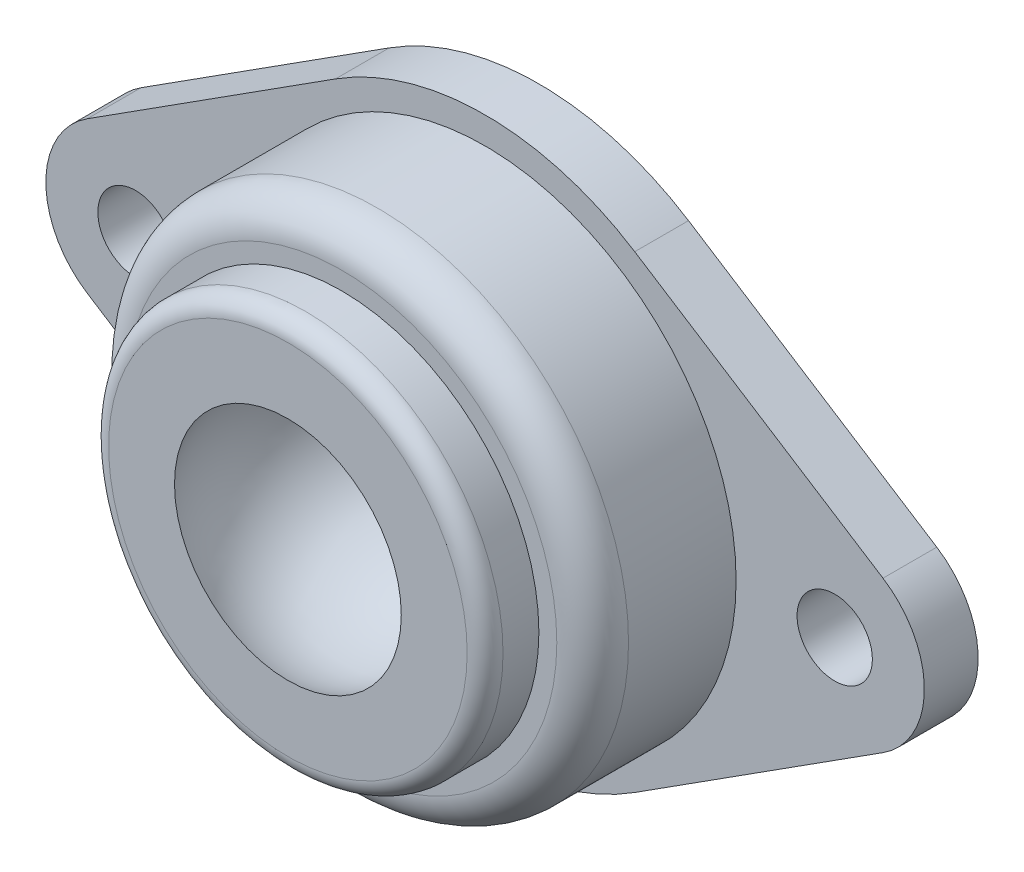
ISO-10303-21;
HEADER;
FILE_DESCRIPTION(('STEP AP214'),'2;1');
FILE_NAME('part.step','',(''),(''),'','','');
FILE_SCHEMA(('AUTOMOTIVE_DESIGN { 1 0 10303 214 1 1 1 1 }'));
ENDSEC;
DATA;
#1=APPLICATION_CONTEXT('core data for automotive mechanical design processes');
#2=APPLICATION_PROTOCOL_DEFINITION('international standard','automotive_design',2000,#1);
#3=PRODUCT_CONTEXT('',#1,'mechanical');
#4=PRODUCT('Part','Part','',(#3));
#5=PRODUCT_RELATED_PRODUCT_CATEGORY('part','',(#4));
#6=PRODUCT_DEFINITION_FORMATION('','',#4);
#7=PRODUCT_DEFINITION_CONTEXT('part definition',#1,'design');
#8=PRODUCT_DEFINITION('design','',#6,#7);
#9=PRODUCT_DEFINITION_SHAPE('','',#8);
#10=(LENGTH_UNIT() NAMED_UNIT(*) SI_UNIT(.MILLI.,.METRE.));
#11=(NAMED_UNIT(*) PLANE_ANGLE_UNIT() SI_UNIT($,.RADIAN.));
#12=(NAMED_UNIT(*) SI_UNIT($,.STERADIAN.) SOLID_ANGLE_UNIT());
#13=UNCERTAINTY_MEASURE_WITH_UNIT(LENGTH_MEASURE(1.E-05),#10,'distance_accuracy_value','');
#14=(GEOMETRIC_REPRESENTATION_CONTEXT(3) GLOBAL_UNCERTAINTY_ASSIGNED_CONTEXT((#13)) GLOBAL_UNIT_ASSIGNED_CONTEXT((#10,
#11,#12)) REPRESENTATION_CONTEXT('',''));
#15=CARTESIAN_POINT('',(0.,0.,0.));
#16=DIRECTION('',(0.,0.,1.));
#17=DIRECTION('',(1.,0.,0.));
#18=AXIS2_PLACEMENT_3D('',#15,#16,#17);
#19=CARTESIAN_POINT('',(-19.5,0.,3.));
#20=DIRECTION('',(0.,0.,1.));
#21=DIRECTION('',(1.,0.,0.));
#22=AXIS2_PLACEMENT_3D('',#19,#20,#21);
#23=PLANE('',#22);
#24=CARTESIAN_POINT('',(0.,0.,3.));
#25=DIRECTION('',(0.,0.,1.));
#26=DIRECTION('',(1.,0.,0.));
#27=AXIS2_PLACEMENT_3D('',#24,#25,#26);
#28=CIRCLE('',#27,14.);
#29=CARTESIAN_POINT('',(14.,0.,3.));
#30=VERTEX_POINT('',#29);
#31=EDGE_CURVE('E253',#30,#30,#28,.T.);
#32=ORIENTED_EDGE('',*,*,#31,.F.);
#33=EDGE_LOOP('',(#32));
#34=FACE_BOUND('',#33,.T.);
#35=CARTESIAN_POINT('',(-19.5,0.,3.));
#36=DIRECTION('',(0.,0.,1.));
#37=DIRECTION('',(1.,0.,0.));
#38=AXIS2_PLACEMENT_3D('',#35,#36,#37);
#39=CIRCLE('',#38,2.1);
#40=CARTESIAN_POINT('',(-17.4,0.,3.));
#41=VERTEX_POINT('',#40);
#42=EDGE_CURVE('E136',#41,#41,#39,.T.);
#43=ORIENTED_EDGE('',*,*,#42,.F.);
#44=EDGE_LOOP('',(#43));
#45=FACE_BOUND('',#44,.T.);
#46=CARTESIAN_POINT('',(-19.5,0.,3.));
#47=DIRECTION('',(0.,0.,1.));
#48=DIRECTION('',(1.,0.,0.));
#49=AXIS2_PLACEMENT_3D('',#46,#47,#48);
#50=CIRCLE('',#49,5.);
#51=CARTESIAN_POINT('',(-22.1923076923077,4.21325044234743,3.));
#52=VERTEX_POINT('',#51);
#53=CARTESIAN_POINT('',(-22.1923076923077,-4.21325044234743,3.));
#54=VERTEX_POINT('',#53);
#55=EDGE_CURVE('E147',#52,#54,#50,.T.);
#56=ORIENTED_EDGE('',*,*,#55,.T.);
#57=DIRECTION('',(0.842650088469486,-0.538461538461539,0.));
#58=VECTOR('',#57,1.);
#59=CARTESIAN_POINT('',(-22.1923076923077,-4.21325044234743,3.));
#60=LINE('',#59,#58);
#61=CARTESIAN_POINT('',(-8.34615384615386,-13.061076371277,3.));
#62=VERTEX_POINT('',#61);
#63=EDGE_CURVE('E95',#54,#62,#60,.T.);
#64=ORIENTED_EDGE('',*,*,#63,.T.);
#65=CARTESIAN_POINT('',(0.,0.,3.));
#66=DIRECTION('',(0.,0.,1.));
#67=DIRECTION('',(1.,0.,0.));
#68=AXIS2_PLACEMENT_3D('',#65,#66,#67);
#69=CIRCLE('',#68,15.5);
#70=CARTESIAN_POINT('',(8.34615384615384,-13.061076371277,3.));
#71=VERTEX_POINT('',#70);
#72=EDGE_CURVE('E236',#62,#71,#69,.T.);
#73=ORIENTED_EDGE('',*,*,#72,.T.);
#74=DIRECTION('',(0.842650088469486,0.538461538461538,0.));
#75=VECTOR('',#74,1.);
#76=CARTESIAN_POINT('',(8.34615384615384,-13.061076371277,3.));
#77=LINE('',#76,#75);
#78=CARTESIAN_POINT('',(22.1923076923077,-4.21325044234743,3.));
#79=VERTEX_POINT('',#78);
#80=EDGE_CURVE('E238',#71,#79,#77,.T.);
#81=ORIENTED_EDGE('',*,*,#80,.T.);
#82=CARTESIAN_POINT('',(19.5,0.,3.));
#83=DIRECTION('',(0.,0.,1.));
#84=DIRECTION('',(1.,0.,0.));
#85=AXIS2_PLACEMENT_3D('',#82,#83,#84);
#86=CIRCLE('',#85,5.);
#87=CARTESIAN_POINT('',(22.1923076923077,4.21325044234743,3.));
#88=VERTEX_POINT('',#87);
#89=EDGE_CURVE('E114',#79,#88,#86,.T.);
#90=ORIENTED_EDGE('',*,*,#89,.T.);
#91=DIRECTION('',(-0.842650088469486,0.538461538461538,0.));
#92=VECTOR('',#91,1.);
#93=CARTESIAN_POINT('',(8.34615384615384,13.061076371277,3.));
#94=LINE('',#93,#92);
#95=CARTESIAN_POINT('',(8.34615384615384,13.061076371277,3.));
#96=VERTEX_POINT('',#95);
#97=EDGE_CURVE('E108',#88,#96,#94,.T.);
#98=ORIENTED_EDGE('',*,*,#97,.T.);
#99=CARTESIAN_POINT('',(0.,0.,3.));
#100=DIRECTION('',(0.,0.,1.));
#101=DIRECTION('',(1.,0.,0.));
#102=AXIS2_PLACEMENT_3D('',#99,#100,#101);
#103=CIRCLE('',#102,15.5);
#104=CARTESIAN_POINT('',(-8.34615384615384,13.061076371277,3.));
#105=VERTEX_POINT('',#104);
#106=EDGE_CURVE('E112',#96,#105,#103,.T.);
#107=ORIENTED_EDGE('',*,*,#106,.T.);
#108=DIRECTION('',(-0.842650088469486,-0.538461538461538,0.));
#109=VECTOR('',#108,1.);
#110=CARTESIAN_POINT('',(-22.1923076923077,4.21325044234743,3.));
#111=LINE('',#110,#109);
#112=EDGE_CURVE('E51',#105,#52,#111,.T.);
#113=ORIENTED_EDGE('',*,*,#112,.T.);
#114=EDGE_LOOP('',(#56,#64,#73,#81,#90,#98,#107,#113));
#115=FACE_BOUND('',#114,.T.);
#116=CARTESIAN_POINT('',(19.5,0.,3.));
#117=DIRECTION('',(0.,0.,1.));
#118=DIRECTION('',(1.,0.,0.));
#119=AXIS2_PLACEMENT_3D('',#116,#117,#118);
#120=CIRCLE('',#119,2.1);
#121=CARTESIAN_POINT('',(21.6,0.,3.));
#122=VERTEX_POINT('',#121);
#123=EDGE_CURVE('E247',#122,#122,#120,.T.);
#124=ORIENTED_EDGE('',*,*,#123,.F.);
#125=EDGE_LOOP('',(#124));
#126=FACE_BOUND('',#125,.T.);
#127=ADVANCED_FACE('F34',(#34,#45,#115,#126),#23,.T.);
#128=CARTESIAN_POINT('',(-19.5,0.,0.));
#129=DIRECTION('',(0.,0.,1.));
#130=DIRECTION('',(1.,0.,0.));
#131=AXIS2_PLACEMENT_3D('',#128,#129,#130);
#132=PLANE('',#131);
#133=CARTESIAN_POINT('',(-19.5,0.,0.));
#134=DIRECTION('',(0.,0.,1.));
#135=DIRECTION('',(1.,0.,0.));
#136=AXIS2_PLACEMENT_3D('',#133,#134,#135);
#137=CIRCLE('',#136,5.);
#138=CARTESIAN_POINT('',(-22.1923076923077,4.21325044234743,0.));
#139=VERTEX_POINT('',#138);
#140=CARTESIAN_POINT('',(-22.1923076923077,-4.21325044234743,0.));
#141=VERTEX_POINT('',#140);
#142=EDGE_CURVE('E132',#139,#141,#137,.T.);
#143=ORIENTED_EDGE('',*,*,#142,.F.);
#144=DIRECTION('',(-0.842650088469486,-0.538461538461538,0.));
#145=VECTOR('',#144,1.);
#146=CARTESIAN_POINT('',(-22.1923076923077,4.21325044234743,0.));
#147=LINE('',#146,#145);
#148=CARTESIAN_POINT('',(-8.34615384615384,13.061076371277,0.));
#149=VERTEX_POINT('',#148);
#150=EDGE_CURVE('E86',#149,#139,#147,.T.);
#151=ORIENTED_EDGE('',*,*,#150,.F.);
#152=CARTESIAN_POINT('',(0.,0.,0.));
#153=DIRECTION('',(0.,0.,1.));
#154=DIRECTION('',(1.,0.,0.));
#155=AXIS2_PLACEMENT_3D('',#152,#153,#154);
#156=CIRCLE('',#155,15.5);
#157=CARTESIAN_POINT('',(8.34615384615384,13.061076371277,0.));
#158=VERTEX_POINT('',#157);
#159=EDGE_CURVE('E80',#158,#149,#156,.T.);
#160=ORIENTED_EDGE('',*,*,#159,.F.);
#161=DIRECTION('',(-0.842650088469486,0.538461538461538,0.));
#162=VECTOR('',#161,1.);
#163=CARTESIAN_POINT('',(8.34615384615384,13.061076371277,0.));
#164=LINE('',#163,#162);
#165=CARTESIAN_POINT('',(22.1923076923077,4.21325044234743,0.));
#166=VERTEX_POINT('',#165);
#167=EDGE_CURVE('E122',#166,#158,#164,.T.);
#168=ORIENTED_EDGE('',*,*,#167,.F.);
#169=CARTESIAN_POINT('',(19.5,0.,0.));
#170=DIRECTION('',(0.,0.,1.));
#171=DIRECTION('',(1.,0.,0.));
#172=AXIS2_PLACEMENT_3D('',#169,#170,#171);
#173=CIRCLE('',#172,5.);
#174=CARTESIAN_POINT('',(22.1923076923077,-4.21325044234743,0.));
#175=VERTEX_POINT('',#174);
#176=EDGE_CURVE('E142',#175,#166,#173,.T.);
#177=ORIENTED_EDGE('',*,*,#176,.F.);
#178=DIRECTION('',(0.842650088469486,0.538461538461538,0.));
#179=VECTOR('',#178,1.);
#180=CARTESIAN_POINT('',(8.34615384615384,-13.061076371277,0.));
#181=LINE('',#180,#179);
#182=CARTESIAN_POINT('',(8.34615384615384,-13.061076371277,0.));
#183=VERTEX_POINT('',#182);
#184=EDGE_CURVE('E140',#183,#175,#181,.T.);
#185=ORIENTED_EDGE('',*,*,#184,.F.);
#186=CARTESIAN_POINT('',(0.,0.,0.));
#187=DIRECTION('',(0.,0.,1.));
#188=DIRECTION('',(1.,0.,0.));
#189=AXIS2_PLACEMENT_3D('',#186,#187,#188);
#190=CIRCLE('',#189,15.5);
#191=CARTESIAN_POINT('',(-8.34615384615386,-13.061076371277,0.));
#192=VERTEX_POINT('',#191);
#193=EDGE_CURVE('E138',#192,#183,#190,.T.);
#194=ORIENTED_EDGE('',*,*,#193,.F.);
#195=DIRECTION('',(0.842650088469486,-0.538461538461539,0.));
#196=VECTOR('',#195,1.);
#197=CARTESIAN_POINT('',(-22.1923076923077,-4.21325044234743,0.));
#198=LINE('',#197,#196);
#199=EDGE_CURVE('E135',#141,#192,#198,.T.);
#200=ORIENTED_EDGE('',*,*,#199,.F.);
#201=EDGE_LOOP('',(#143,#151,#160,#168,#177,#185,#194,#200));
#202=FACE_BOUND('',#201,.T.);
#203=CARTESIAN_POINT('',(-19.5,0.,0.));
#204=DIRECTION('',(0.,0.,1.));
#205=DIRECTION('',(1.,0.,0.));
#206=AXIS2_PLACEMENT_3D('',#203,#204,#205);
#207=CIRCLE('',#206,2.1);
#208=CARTESIAN_POINT('',(-17.4,0.,0.));
#209=VERTEX_POINT('',#208);
#210=EDGE_CURVE('E244',#209,#209,#207,.T.);
#211=ORIENTED_EDGE('',*,*,#210,.T.);
#212=EDGE_LOOP('',(#211));
#213=FACE_BOUND('',#212,.T.);
#214=CARTESIAN_POINT('',(19.5,0.,0.));
#215=DIRECTION('',(0.,0.,1.));
#216=DIRECTION('',(1.,0.,0.));
#217=AXIS2_PLACEMENT_3D('',#214,#215,#216);
#218=CIRCLE('',#217,2.1);
#219=CARTESIAN_POINT('',(21.6,0.,0.));
#220=VERTEX_POINT('',#219);
#221=EDGE_CURVE('E250',#220,#220,#218,.T.);
#222=ORIENTED_EDGE('',*,*,#221,.T.);
#223=EDGE_LOOP('',(#222));
#224=FACE_BOUND('',#223,.T.);
#225=ADVANCED_FACE('F187',(#202,#213,#224),#132,.F.);
#226=CARTESIAN_POINT('',(-19.5,0.,3.));
#227=DIRECTION('',(0.,0.,-1.));
#228=DIRECTION('',(-1.,0.,0.));
#229=AXIS2_PLACEMENT_3D('',#226,#227,#228);
#230=CYLINDRICAL_SURFACE('',#229,5.);
#231=ORIENTED_EDGE('',*,*,#142,.T.);
#232=DIRECTION('',(0.,0.,-1.));
#233=VECTOR('',#232,1.);
#234=CARTESIAN_POINT('',(-22.1923076923077,-4.21325044234743,3.));
#235=LINE('',#234,#233);
#236=EDGE_CURVE('E160',#54,#141,#235,.T.);
#237=ORIENTED_EDGE('',*,*,#236,.F.);
#238=ORIENTED_EDGE('',*,*,#55,.F.);
#239=DIRECTION('',(0.,0.,-1.));
#240=VECTOR('',#239,1.);
#241=CARTESIAN_POINT('',(-22.1923076923077,4.21325044234743,3.));
#242=LINE('',#241,#240);
#243=EDGE_CURVE('E128',#52,#139,#242,.T.);
#244=ORIENTED_EDGE('',*,*,#243,.T.);
#245=EDGE_LOOP('',(#231,#237,#238,#244));
#246=FACE_BOUND('',#245,.T.);
#247=ADVANCED_FACE('F193',(#246),#230,.T.);
#248=CARTESIAN_POINT('',(-22.1923076923077,-4.21325044234743,3.));
#249=DIRECTION('',(0.538461538461539,0.842650088469486,0.));
#250=DIRECTION('',(-0.842650088469486,0.538461538461539,0.));
#251=AXIS2_PLACEMENT_3D('',#248,#249,#250);
#252=PLANE('',#251);
#253=ORIENTED_EDGE('',*,*,#199,.T.);
#254=DIRECTION('',(0.,0.,-1.));
#255=VECTOR('',#254,1.);
#256=CARTESIAN_POINT('',(-8.34615384615386,-13.061076371277,3.));
#257=LINE('',#256,#255);
#258=EDGE_CURVE('E157',#62,#192,#257,.T.);
#259=ORIENTED_EDGE('',*,*,#258,.F.);
#260=ORIENTED_EDGE('',*,*,#63,.F.);
#261=ORIENTED_EDGE('',*,*,#236,.T.);
#262=EDGE_LOOP('',(#253,#259,#260,#261));
#263=FACE_BOUND('',#262,.T.);
#264=ADVANCED_FACE('F220',(#263),#252,.F.);
#265=CARTESIAN_POINT('',(0.,0.,3.));
#266=DIRECTION('',(0.,0.,-1.));
#267=DIRECTION('',(-1.,0.,0.));
#268=AXIS2_PLACEMENT_3D('',#265,#266,#267);
#269=CYLINDRICAL_SURFACE('',#268,15.5);
#270=ORIENTED_EDGE('',*,*,#193,.T.);
#271=DIRECTION('',(0.,0.,-1.));
#272=VECTOR('',#271,1.);
#273=CARTESIAN_POINT('',(8.34615384615384,-13.061076371277,3.));
#274=LINE('',#273,#272);
#275=EDGE_CURVE('E154',#71,#183,#274,.T.);
#276=ORIENTED_EDGE('',*,*,#275,.F.);
#277=ORIENTED_EDGE('',*,*,#72,.F.);
#278=ORIENTED_EDGE('',*,*,#258,.T.);
#279=EDGE_LOOP('',(#270,#276,#277,#278));
#280=FACE_BOUND('',#279,.T.);
#281=ADVANCED_FACE('F216',(#280),#269,.T.);
#282=CARTESIAN_POINT('',(8.34615384615384,-13.061076371277,3.));
#283=DIRECTION('',(-0.538461538461538,0.842650088469486,0.));
#284=DIRECTION('',(-0.842650088469486,-0.538461538461538,0.));
#285=AXIS2_PLACEMENT_3D('',#282,#283,#284);
#286=PLANE('',#285);
#287=ORIENTED_EDGE('',*,*,#184,.T.);
#288=DIRECTION('',(0.,0.,-1.));
#289=VECTOR('',#288,1.);
#290=CARTESIAN_POINT('',(22.1923076923077,-4.21325044234743,3.));
#291=LINE('',#290,#289);
#292=EDGE_CURVE('E151',#79,#175,#291,.T.);
#293=ORIENTED_EDGE('',*,*,#292,.F.);
#294=ORIENTED_EDGE('',*,*,#80,.F.);
#295=ORIENTED_EDGE('',*,*,#275,.T.);
#296=EDGE_LOOP('',(#287,#293,#294,#295));
#297=FACE_BOUND('',#296,.T.);
#298=ADVANCED_FACE('F212',(#297),#286,.F.);
#299=CARTESIAN_POINT('',(19.5,0.,3.));
#300=DIRECTION('',(0.,0.,-1.));
#301=DIRECTION('',(-1.,0.,0.));
#302=AXIS2_PLACEMENT_3D('',#299,#300,#301);
#303=CYLINDRICAL_SURFACE('',#302,5.);
#304=ORIENTED_EDGE('',*,*,#176,.T.);
#305=DIRECTION('',(0.,0.,-1.));
#306=VECTOR('',#305,1.);
#307=CARTESIAN_POINT('',(22.1923076923077,4.21325044234743,3.));
#308=LINE('',#307,#306);
#309=EDGE_CURVE('E123',#88,#166,#308,.T.);
#310=ORIENTED_EDGE('',*,*,#309,.F.);
#311=ORIENTED_EDGE('',*,*,#89,.F.);
#312=ORIENTED_EDGE('',*,*,#292,.T.);
#313=EDGE_LOOP('',(#304,#310,#311,#312));
#314=FACE_BOUND('',#313,.T.);
#315=ADVANCED_FACE('F209',(#314),#303,.T.);
#316=CARTESIAN_POINT('',(8.34615384615384,13.061076371277,3.));
#317=DIRECTION('',(-0.538461538461538,-0.842650088469486,0.));
#318=DIRECTION('',(0.842650088469486,-0.538461538461538,0.));
#319=AXIS2_PLACEMENT_3D('',#316,#317,#318);
#320=PLANE('',#319);
#321=ORIENTED_EDGE('',*,*,#167,.T.);
#322=DIRECTION('',(0.,0.,-1.));
#323=VECTOR('',#322,1.);
#324=CARTESIAN_POINT('',(8.34615384615384,13.061076371277,3.));
#325=LINE('',#324,#323);
#326=EDGE_CURVE('E119',#96,#158,#325,.T.);
#327=ORIENTED_EDGE('',*,*,#326,.F.);
#328=ORIENTED_EDGE('',*,*,#97,.F.);
#329=ORIENTED_EDGE('',*,*,#309,.T.);
#330=EDGE_LOOP('',(#321,#327,#328,#329));
#331=FACE_BOUND('',#330,.T.);
#332=ADVANCED_FACE('F120',(#331),#320,.F.);
#333=CARTESIAN_POINT('',(0.,0.,3.));
#334=DIRECTION('',(0.,0.,-1.));
#335=DIRECTION('',(-1.,0.,0.));
#336=AXIS2_PLACEMENT_3D('',#333,#334,#335);
#337=CYLINDRICAL_SURFACE('',#336,15.5);
#338=ORIENTED_EDGE('',*,*,#159,.T.);
#339=DIRECTION('',(0.,0.,-1.));
#340=VECTOR('',#339,1.);
#341=CARTESIAN_POINT('',(-8.34615384615384,13.061076371277,3.));
#342=LINE('',#341,#340);
#343=EDGE_CURVE('E124',#105,#149,#342,.T.);
#344=ORIENTED_EDGE('',*,*,#343,.F.);
#345=ORIENTED_EDGE('',*,*,#106,.F.);
#346=ORIENTED_EDGE('',*,*,#326,.T.);
#347=EDGE_LOOP('',(#338,#344,#345,#346));
#348=FACE_BOUND('',#347,.T.);
#349=ADVANCED_FACE('F126',(#348),#337,.T.);
#350=CARTESIAN_POINT('',(-22.1923076923077,4.21325044234743,3.));
#351=DIRECTION('',(0.538461538461539,-0.842650088469486,0.));
#352=DIRECTION('',(0.842650088469486,0.538461538461539,0.));
#353=AXIS2_PLACEMENT_3D('',#350,#351,#352);
#354=PLANE('',#353);
#355=ORIENTED_EDGE('',*,*,#150,.T.);
#356=ORIENTED_EDGE('',*,*,#243,.F.);
#357=ORIENTED_EDGE('',*,*,#112,.F.);
#358=ORIENTED_EDGE('',*,*,#343,.T.);
#359=EDGE_LOOP('',(#355,#356,#357,#358));
#360=FACE_BOUND('',#359,.T.);
#361=ADVANCED_FACE('F202',(#360),#354,.F.);
#362=CARTESIAN_POINT('',(-19.5,0.,3.));
#363=DIRECTION('',(0.,0.,-1.));
#364=DIRECTION('',(-1.,0.,0.));
#365=AXIS2_PLACEMENT_3D('',#362,#363,#364);
#366=CYLINDRICAL_SURFACE('',#365,2.1);
#367=ORIENTED_EDGE('',*,*,#42,.T.);
#368=EDGE_LOOP('',(#367));
#369=FACE_BOUND('',#368,.T.);
#370=ORIENTED_EDGE('',*,*,#210,.F.);
#371=EDGE_LOOP('',(#370));
#372=FACE_BOUND('',#371,.T.);
#373=ADVANCED_FACE('F199',(#369,#372),#366,.F.);
#374=CARTESIAN_POINT('',(19.5,0.,3.));
#375=DIRECTION('',(0.,0.,-1.));
#376=DIRECTION('',(-1.,0.,0.));
#377=AXIS2_PLACEMENT_3D('',#374,#375,#376);
#378=CYLINDRICAL_SURFACE('',#377,2.1);
#379=ORIENTED_EDGE('',*,*,#123,.T.);
#380=EDGE_LOOP('',(#379));
#381=FACE_BOUND('',#380,.T.);
#382=ORIENTED_EDGE('',*,*,#221,.F.);
#383=EDGE_LOOP('',(#382));
#384=FACE_BOUND('',#383,.T.);
#385=ADVANCED_FACE('F274',(#381,#384),#378,.F.);
#386=CARTESIAN_POINT('',(0.,0.,11.));
#387=DIRECTION('',(0.,0.,-1.));
#388=DIRECTION('',(-1.,0.,0.));
#389=AXIS2_PLACEMENT_3D('',#386,#387,#388);
#390=CYLINDRICAL_SURFACE('',#389,14.);
#391=CARTESIAN_POINT('',(0.,0.,9.));
#392=DIRECTION('',(0.,0.,1.));
#393=DIRECTION('',(1.,0.,0.));
#394=AXIS2_PLACEMENT_3D('',#391,#392,#393);
#395=CIRCLE('',#394,14.);
#396=CARTESIAN_POINT('',(14.,0.,9.));
#397=VERTEX_POINT('',#396);
#398=EDGE_CURVE('E169',#397,#397,#395,.F.);
#399=ORIENTED_EDGE('',*,*,#398,.T.);
#400=EDGE_LOOP('',(#399));
#401=FACE_BOUND('',#400,.T.);
#402=ORIENTED_EDGE('',*,*,#31,.T.);
#403=EDGE_LOOP('',(#402));
#404=FACE_BOUND('',#403,.T.);
#405=ADVANCED_FACE('F265',(#401,#404),#390,.T.);
#406=CARTESIAN_POINT('',(0.,0.,11.));
#407=DIRECTION('',(0.,0.,1.));
#408=DIRECTION('',(1.,0.,0.));
#409=AXIS2_PLACEMENT_3D('',#406,#407,#408);
#410=PLANE('',#409);
#411=CARTESIAN_POINT('',(0.,0.,11.));
#412=DIRECTION('',(0.,0.,1.));
#413=DIRECTION('',(1.,0.,0.));
#414=AXIS2_PLACEMENT_3D('',#411,#412,#413);
#415=CIRCLE('',#414,12.);
#416=CARTESIAN_POINT('',(12.,0.,11.));
#417=VERTEX_POINT('',#416);
#418=EDGE_CURVE('E162',#417,#417,#415,.T.);
#419=ORIENTED_EDGE('',*,*,#418,.T.);
#420=EDGE_LOOP('',(#419));
#421=FACE_BOUND('',#420,.T.);
#422=CARTESIAN_POINT('',(0.,0.,11.));
#423=DIRECTION('',(0.,0.,1.));
#424=DIRECTION('',(1.,0.,0.));
#425=AXIS2_PLACEMENT_3D('',#422,#423,#424);
#426=CIRCLE('',#425,11.);
#427=CARTESIAN_POINT('',(11.,0.,11.));
#428=VERTEX_POINT('',#427);
#429=EDGE_CURVE('E166',#428,#428,#426,.T.);
#430=ORIENTED_EDGE('',*,*,#429,.F.);
#431=EDGE_LOOP('',(#430));
#432=FACE_BOUND('',#431,.T.);
#433=ADVANCED_FACE('F263',(#421,#432),#410,.T.);
#434=CARTESIAN_POINT('',(0.,0.,14.));
#435=DIRECTION('',(0.,0.,-1.));
#436=DIRECTION('',(-1.,0.,0.));
#437=AXIS2_PLACEMENT_3D('',#434,#435,#436);
#438=CYLINDRICAL_SURFACE('',#437,11.);
#439=CARTESIAN_POINT('',(0.,0.,13.));
#440=DIRECTION('',(0.,0.,1.));
#441=DIRECTION('',(1.,0.,0.));
#442=AXIS2_PLACEMENT_3D('',#439,#440,#441);
#443=CIRCLE('',#442,11.);
#444=CARTESIAN_POINT('',(11.,0.,13.));
#445=VERTEX_POINT('',#444);
#446=EDGE_CURVE('E11',#445,#445,#443,.F.);
#447=ORIENTED_EDGE('',*,*,#446,.T.);
#448=EDGE_LOOP('',(#447));
#449=FACE_BOUND('',#448,.T.);
#450=ORIENTED_EDGE('',*,*,#429,.T.);
#451=EDGE_LOOP('',(#450));
#452=FACE_BOUND('',#451,.T.);
#453=ADVANCED_FACE('F261',(#449,#452),#438,.T.);
#454=CARTESIAN_POINT('',(0.,0.,14.));
#455=DIRECTION('',(0.,0.,1.));
#456=DIRECTION('',(1.,0.,0.));
#457=AXIS2_PLACEMENT_3D('',#454,#455,#456);
#458=PLANE('',#457);
#459=CARTESIAN_POINT('',(0.,0.,14.));
#460=DIRECTION('',(0.,0.,1.));
#461=DIRECTION('',(1.,0.,0.));
#462=AXIS2_PLACEMENT_3D('',#459,#460,#461);
#463=CIRCLE('',#462,10.);
#464=CARTESIAN_POINT('',(10.,0.,14.));
#465=VERTEX_POINT('',#464);
#466=EDGE_CURVE('E43',#465,#465,#463,.T.);
#467=ORIENTED_EDGE('',*,*,#466,.T.);
#468=EDGE_LOOP('',(#467));
#469=FACE_BOUND('',#468,.T.);
#470=CARTESIAN_POINT('',(0.,0.,14.));
#471=DIRECTION('',(0.,0.,1.));
#472=DIRECTION('',(1.,0.,0.));
#473=AXIS2_PLACEMENT_3D('',#470,#471,#472);
#474=CIRCLE('',#473,6.32455532033676);
#475=CARTESIAN_POINT('',(6.32455532033676,0.,14.));
#476=VERTEX_POINT('',#475);
#477=EDGE_CURVE('E163',#476,#476,#474,.F.);
#478=ORIENTED_EDGE('',*,*,#477,.T.);
#479=EDGE_LOOP('',(#478));
#480=FACE_BOUND('',#479,.T.);
#481=ADVANCED_FACE('F174',(#469,#480),#458,.T.);
#482=CARTESIAN_POINT('',(0.,0.,11.));
#483=DIRECTION('',(0.,0.,1.));
#484=DIRECTION('',(0.,1.,0.));
#485=AXIS2_PLACEMENT_3D('',#482,#483,#484);
#486=SPHERICAL_SURFACE('',#485,7.);
#487=ORIENTED_EDGE('',*,*,#477,.F.);
#488=EDGE_LOOP('',(#487));
#489=FACE_BOUND('',#488,.T.);
#490=ADVANCED_FACE('F183',(#489),#486,.F.);
#491=CARTESIAN_POINT('',(0.,0.,9.));
#492=DIRECTION('',(0.,0.,1.));
#493=DIRECTION('',(1.,0.,0.));
#494=AXIS2_PLACEMENT_3D('',#491,#492,#493);
#495=TOROIDAL_SURFACE('',#494,12.,2.);
#496=ORIENTED_EDGE('',*,*,#398,.F.);
#497=EDGE_LOOP('',(#496));
#498=FACE_BOUND('',#497,.T.);
#499=ORIENTED_EDGE('',*,*,#418,.F.);
#500=EDGE_LOOP('',(#499));
#501=FACE_BOUND('',#500,.T.);
#502=ADVANCED_FACE('F178',(#498,#501),#495,.T.);
#503=CARTESIAN_POINT('',(0.,0.,13.));
#504=DIRECTION('',(0.,0.,1.));
#505=DIRECTION('',(1.,0.,0.));
#506=AXIS2_PLACEMENT_3D('',#503,#504,#505);
#507=TOROIDAL_SURFACE('',#506,10.,1.);
#508=ORIENTED_EDGE('',*,*,#446,.F.);
#509=EDGE_LOOP('',(#508));
#510=FACE_BOUND('',#509,.T.);
#511=ORIENTED_EDGE('',*,*,#466,.F.);
#512=EDGE_LOOP('',(#511));
#513=FACE_BOUND('',#512,.T.);
#514=ADVANCED_FACE('F36',(#510,#513),#507,.T.);
#515=CLOSED_SHELL('',(#127,#225,#247,#264,#281,#298,#315,#332,#349,#361,#373,#385,#405,#433,
#453,#481,#490,#502,#514));
#516=MANIFOLD_SOLID_BREP('B2',#515);
#517=ADVANCED_BREP_SHAPE_REPRESENTATION('',(#18,#516),#14);
#518=SHAPE_DEFINITION_REPRESENTATION(#9,#517);
ENDSEC;
END-ISO-10303-21;
